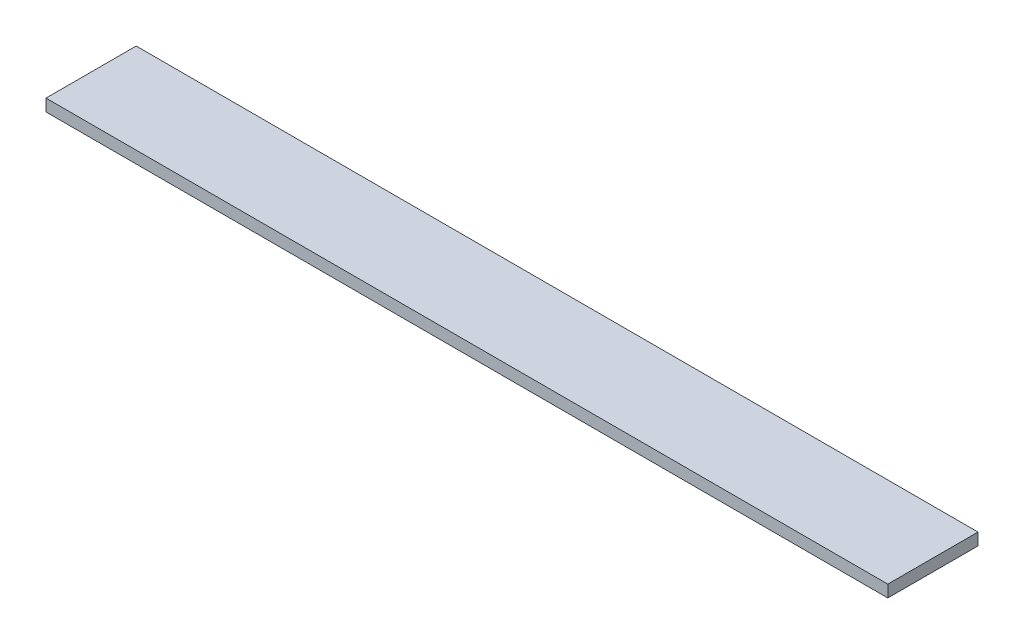
ISO-10303-21;
HEADER;
FILE_DESCRIPTION(('STEP AP214'),'2;1');
FILE_NAME('part.step','',(''),(''),'','','');
FILE_SCHEMA(('AUTOMOTIVE_DESIGN { 1 0 10303 214 1 1 1 1 }'));
ENDSEC;
DATA;
#1=APPLICATION_CONTEXT('core data for automotive mechanical design processes');
#2=APPLICATION_PROTOCOL_DEFINITION('international standard','automotive_design',2000,#1);
#3=PRODUCT_CONTEXT('',#1,'mechanical');
#4=PRODUCT('Part','Part','',(#3));
#5=PRODUCT_RELATED_PRODUCT_CATEGORY('part','',(#4));
#6=PRODUCT_DEFINITION_FORMATION('','',#4);
#7=PRODUCT_DEFINITION_CONTEXT('part definition',#1,'design');
#8=PRODUCT_DEFINITION('design','',#6,#7);
#9=PRODUCT_DEFINITION_SHAPE('','',#8);
#10=(LENGTH_UNIT() NAMED_UNIT(*) SI_UNIT(.MILLI.,.METRE.));
#11=(NAMED_UNIT(*) PLANE_ANGLE_UNIT() SI_UNIT($,.RADIAN.));
#12=(NAMED_UNIT(*) SI_UNIT($,.STERADIAN.) SOLID_ANGLE_UNIT());
#13=UNCERTAINTY_MEASURE_WITH_UNIT(LENGTH_MEASURE(1.E-05),#10,'distance_accuracy_value','');
#14=(GEOMETRIC_REPRESENTATION_CONTEXT(3) GLOBAL_UNCERTAINTY_ASSIGNED_CONTEXT((#13)) GLOBAL_UNIT_ASSIGNED_CONTEXT((#10,
#11,#12)) REPRESENTATION_CONTEXT('',''));
#15=CARTESIAN_POINT('',(0.,0.,0.));
#16=DIRECTION('',(0.,0.,1.));
#17=DIRECTION('',(1.,0.,0.));
#18=AXIS2_PLACEMENT_3D('',#15,#16,#17);
#19=CARTESIAN_POINT('',(-70.,2.,7.50000000000001));
#20=DIRECTION('',(1.,0.,0.));
#21=DIRECTION('',(0.,0.,-1.));
#22=AXIS2_PLACEMENT_3D('',#19,#20,#21);
#23=PLANE('',#22);
#24=DIRECTION('',(0.,0.,1.));
#25=VECTOR('',#24,1.);
#26=CARTESIAN_POINT('',(-70.,0.,7.50000000000001));
#27=LINE('',#26,#25);
#28=CARTESIAN_POINT('',(-70.,0.,-7.49999999999999));
#29=VERTEX_POINT('',#28);
#30=CARTESIAN_POINT('',(-70.,0.,7.50000000000001));
#31=VERTEX_POINT('',#30);
#32=EDGE_CURVE('E96',#29,#31,#27,.T.);
#33=ORIENTED_EDGE('',*,*,#32,.T.);
#34=DIRECTION('',(0.,-1.,0.));
#35=VECTOR('',#34,1.);
#36=CARTESIAN_POINT('',(-70.,2.,7.50000000000001));
#37=LINE('',#36,#35);
#38=CARTESIAN_POINT('',(-70.,2.,7.50000000000001));
#39=VERTEX_POINT('',#38);
#40=EDGE_CURVE('E11',#39,#31,#37,.T.);
#41=ORIENTED_EDGE('',*,*,#40,.F.);
#42=DIRECTION('',(0.,0.,1.));
#43=VECTOR('',#42,1.);
#44=CARTESIAN_POINT('',(-70.,2.,7.50000000000001));
#45=LINE('',#44,#43);
#46=CARTESIAN_POINT('',(-70.,2.,-7.49999999999999));
#47=VERTEX_POINT('',#46);
#48=EDGE_CURVE('E84',#47,#39,#45,.T.);
#49=ORIENTED_EDGE('',*,*,#48,.F.);
#50=DIRECTION('',(0.,-1.,0.));
#51=VECTOR('',#50,1.);
#52=CARTESIAN_POINT('',(-70.,2.,-7.49999999999999));
#53=LINE('',#52,#51);
#54=EDGE_CURVE('E92',#47,#29,#53,.T.);
#55=ORIENTED_EDGE('',*,*,#54,.T.);
#56=EDGE_LOOP('',(#33,#41,#49,#55));
#57=FACE_BOUND('',#56,.T.);
#58=ADVANCED_FACE('F33',(#57),#23,.F.);
#59=CARTESIAN_POINT('',(70.,2.,7.49999999999999));
#60=DIRECTION('',(0.,0.,-1.));
#61=DIRECTION('',(-1.,0.,0.));
#62=AXIS2_PLACEMENT_3D('',#59,#60,#61);
#63=PLANE('',#62);
#64=DIRECTION('',(1.,0.,0.));
#65=VECTOR('',#64,1.);
#66=CARTESIAN_POINT('',(70.,0.,7.49999999999999));
#67=LINE('',#66,#65);
#68=CARTESIAN_POINT('',(70.,0.,7.49999999999999));
#69=VERTEX_POINT('',#68);
#70=EDGE_CURVE('E88',#31,#69,#67,.T.);
#71=ORIENTED_EDGE('',*,*,#70,.T.);
#72=DIRECTION('',(0.,-1.,0.));
#73=VECTOR('',#72,1.);
#74=CARTESIAN_POINT('',(70.,2.,7.49999999999999));
#75=LINE('',#74,#73);
#76=CARTESIAN_POINT('',(70.,2.,7.49999999999999));
#77=VERTEX_POINT('',#76);
#78=EDGE_CURVE('E41',#77,#69,#75,.T.);
#79=ORIENTED_EDGE('',*,*,#78,.F.);
#80=DIRECTION('',(1.,0.,0.));
#81=VECTOR('',#80,1.);
#82=CARTESIAN_POINT('',(70.,2.,7.49999999999999));
#83=LINE('',#82,#81);
#84=EDGE_CURVE('E79',#39,#77,#83,.T.);
#85=ORIENTED_EDGE('',*,*,#84,.F.);
#86=ORIENTED_EDGE('',*,*,#40,.T.);
#87=EDGE_LOOP('',(#71,#79,#85,#86));
#88=FACE_BOUND('',#87,.T.);
#89=ADVANCED_FACE('F87',(#88),#63,.F.);
#90=CARTESIAN_POINT('',(70.,2.,7.49999999999999));
#91=DIRECTION('',(-1.,0.,0.));
#92=DIRECTION('',(0.,0.,1.));
#93=AXIS2_PLACEMENT_3D('',#90,#91,#92);
#94=PLANE('',#93);
#95=DIRECTION('',(0.,0.,-1.));
#96=VECTOR('',#95,1.);
#97=CARTESIAN_POINT('',(70.,0.,7.49999999999999));
#98=LINE('',#97,#96);
#99=CARTESIAN_POINT('',(70.,0.,-7.50000000000001));
#100=VERTEX_POINT('',#99);
#101=EDGE_CURVE('E66',#69,#100,#98,.T.);
#102=ORIENTED_EDGE('',*,*,#101,.T.);
#103=DIRECTION('',(0.,-1.,0.));
#104=VECTOR('',#103,1.);
#105=CARTESIAN_POINT('',(70.,2.,-7.50000000000001));
#106=LINE('',#105,#104);
#107=CARTESIAN_POINT('',(70.,2.,-7.50000000000001));
#108=VERTEX_POINT('',#107);
#109=EDGE_CURVE('E89',#108,#100,#106,.T.);
#110=ORIENTED_EDGE('',*,*,#109,.F.);
#111=DIRECTION('',(0.,0.,-1.));
#112=VECTOR('',#111,1.);
#113=CARTESIAN_POINT('',(70.,2.,7.49999999999999));
#114=LINE('',#113,#112);
#115=EDGE_CURVE('E82',#77,#108,#114,.T.);
#116=ORIENTED_EDGE('',*,*,#115,.F.);
#117=ORIENTED_EDGE('',*,*,#78,.T.);
#118=EDGE_LOOP('',(#102,#110,#116,#117));
#119=FACE_BOUND('',#118,.T.);
#120=ADVANCED_FACE('F90',(#119),#94,.F.);
#121=CARTESIAN_POINT('',(70.,2.,-7.50000000000001));
#122=DIRECTION('',(0.,0.,1.));
#123=DIRECTION('',(1.,0.,0.));
#124=AXIS2_PLACEMENT_3D('',#121,#122,#123);
#125=PLANE('',#124);
#126=DIRECTION('',(-1.,0.,0.));
#127=VECTOR('',#126,1.);
#128=CARTESIAN_POINT('',(70.,0.,-7.50000000000001));
#129=LINE('',#128,#127);
#130=EDGE_CURVE('E72',#100,#29,#129,.T.);
#131=ORIENTED_EDGE('',*,*,#130,.T.);
#132=ORIENTED_EDGE('',*,*,#54,.F.);
#133=DIRECTION('',(-1.,0.,0.));
#134=VECTOR('',#133,1.);
#135=CARTESIAN_POINT('',(70.,2.,-7.50000000000001));
#136=LINE('',#135,#134);
#137=EDGE_CURVE('E49',#108,#47,#136,.T.);
#138=ORIENTED_EDGE('',*,*,#137,.F.);
#139=ORIENTED_EDGE('',*,*,#109,.T.);
#140=EDGE_LOOP('',(#131,#132,#138,#139));
#141=FACE_BOUND('',#140,.T.);
#142=ADVANCED_FACE('F103',(#141),#125,.F.);
#143=CARTESIAN_POINT('',(0.,2.,0.));
#144=DIRECTION('',(0.,1.,0.));
#145=DIRECTION('',(0.,0.,1.));
#146=AXIS2_PLACEMENT_3D('',#143,#144,#145);
#147=PLANE('',#146);
#148=ORIENTED_EDGE('',*,*,#48,.T.);
#149=ORIENTED_EDGE('',*,*,#84,.T.);
#150=ORIENTED_EDGE('',*,*,#115,.T.);
#151=ORIENTED_EDGE('',*,*,#137,.T.);
#152=EDGE_LOOP('',(#148,#149,#150,#151));
#153=FACE_BOUND('',#152,.T.);
#154=ADVANCED_FACE('F80',(#153),#147,.T.);
#155=CARTESIAN_POINT('',(0.,0.,0.));
#156=DIRECTION('',(0.,1.,0.));
#157=DIRECTION('',(0.,0.,1.));
#158=AXIS2_PLACEMENT_3D('',#155,#156,#157);
#159=PLANE('',#158);
#160=ORIENTED_EDGE('',*,*,#32,.F.);
#161=ORIENTED_EDGE('',*,*,#130,.F.);
#162=ORIENTED_EDGE('',*,*,#101,.F.);
#163=ORIENTED_EDGE('',*,*,#70,.F.);
#164=EDGE_LOOP('',(#160,#161,#162,#163));
#165=FACE_BOUND('',#164,.T.);
#166=ADVANCED_FACE('F106',(#165),#159,.F.);
#167=CLOSED_SHELL('',(#58,#89,#120,#142,#154,#166));
#168=MANIFOLD_SOLID_BREP('B2',#167);
#169=ADVANCED_BREP_SHAPE_REPRESENTATION('',(#18,#168),#14);
#170=SHAPE_DEFINITION_REPRESENTATION(#9,#169);
ENDSEC;
END-ISO-10303-21;
